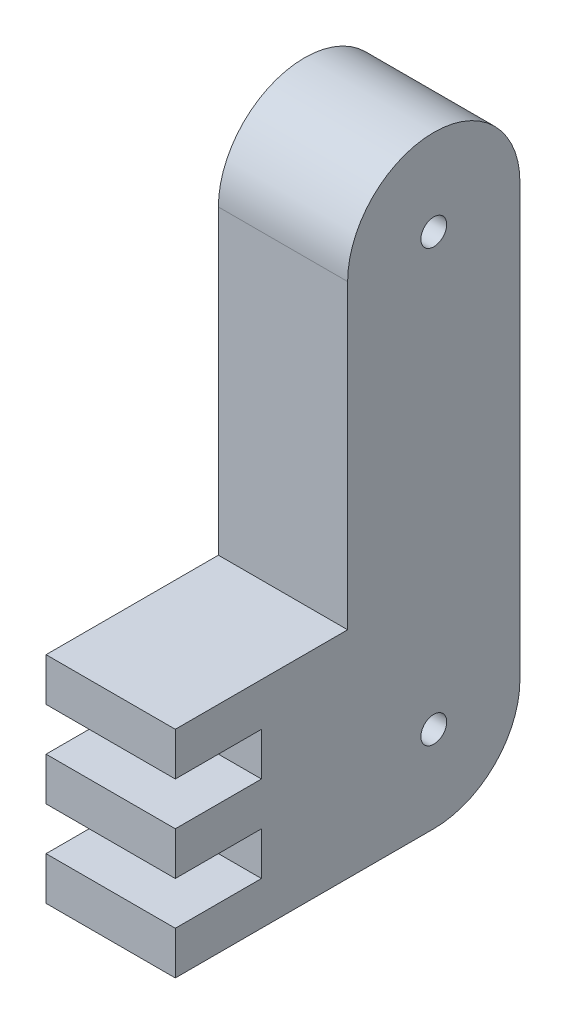
ISO-10303-21;
HEADER;
FILE_DESCRIPTION(('STEP AP214'),'2;1');
FILE_NAME('part.step','',(''),(''),'','','');
FILE_SCHEMA(('AUTOMOTIVE_DESIGN { 1 0 10303 214 1 1 1 1 }'));
ENDSEC;
DATA;
#1=APPLICATION_CONTEXT('core data for automotive mechanical design processes');
#2=APPLICATION_PROTOCOL_DEFINITION('international standard','automotive_design',2000,#1);
#3=PRODUCT_CONTEXT('',#1,'mechanical');
#4=PRODUCT('Part','Part','',(#3));
#5=PRODUCT_RELATED_PRODUCT_CATEGORY('part','',(#4));
#6=PRODUCT_DEFINITION_FORMATION('','',#4);
#7=PRODUCT_DEFINITION_CONTEXT('part definition',#1,'design');
#8=PRODUCT_DEFINITION('design','',#6,#7);
#9=PRODUCT_DEFINITION_SHAPE('','',#8);
#10=(LENGTH_UNIT() NAMED_UNIT(*) SI_UNIT(.MILLI.,.METRE.));
#11=(NAMED_UNIT(*) PLANE_ANGLE_UNIT() SI_UNIT($,.RADIAN.));
#12=(NAMED_UNIT(*) SI_UNIT($,.STERADIAN.) SOLID_ANGLE_UNIT());
#13=UNCERTAINTY_MEASURE_WITH_UNIT(LENGTH_MEASURE(1.E-05),#10,'distance_accuracy_value','');
#14=(GEOMETRIC_REPRESENTATION_CONTEXT(3) GLOBAL_UNCERTAINTY_ASSIGNED_CONTEXT((#13)) GLOBAL_UNIT_ASSIGNED_CONTEXT((#10,
#11,#12)) REPRESENTATION_CONTEXT('',''));
#15=CARTESIAN_POINT('',(0.,0.,0.));
#16=DIRECTION('',(0.,0.,1.));
#17=DIRECTION('',(1.,0.,0.));
#18=AXIS2_PLACEMENT_3D('',#15,#16,#17);
#19=CARTESIAN_POINT('',(15.,15.,30.));
#20=DIRECTION('',(0.,0.,-1.));
#21=DIRECTION('',(0.,1.,0.));
#22=AXIS2_PLACEMENT_3D('',#19,#20,#21);
#23=PLANE('',#22);
#24=DIRECTION('',(0.,-1.,0.));
#25=VECTOR('',#24,1.);
#26=CARTESIAN_POINT('',(0.,15.,30.));
#27=LINE('',#26,#25);
#28=CARTESIAN_POINT('',(0.,15.,30.));
#29=VERTEX_POINT('',#28);
#30=CARTESIAN_POINT('',(0.,10.,30.));
#31=VERTEX_POINT('',#30);
#32=EDGE_CURVE('E268',#29,#31,#27,.T.);
#33=ORIENTED_EDGE('',*,*,#32,.T.);
#34=DIRECTION('',(1.,0.,0.));
#35=VECTOR('',#34,1.);
#36=CARTESIAN_POINT('',(0.,10.,30.));
#37=LINE('',#36,#35);
#38=CARTESIAN_POINT('',(15.,10.,30.));
#39=VERTEX_POINT('',#38);
#40=EDGE_CURVE('E186',#31,#39,#37,.T.);
#41=ORIENTED_EDGE('',*,*,#40,.T.);
#42=DIRECTION('',(0.,-1.,0.));
#43=VECTOR('',#42,1.);
#44=CARTESIAN_POINT('',(15.,15.,30.));
#45=LINE('',#44,#43);
#46=CARTESIAN_POINT('',(15.,15.,30.));
#47=VERTEX_POINT('',#46);
#48=EDGE_CURVE('E243',#47,#39,#45,.T.);
#49=ORIENTED_EDGE('',*,*,#48,.F.);
#50=DIRECTION('',(-1.,0.,0.));
#51=VECTOR('',#50,1.);
#52=CARTESIAN_POINT('',(15.,15.,30.));
#53=LINE('',#52,#51);
#54=EDGE_CURVE('E267',#47,#29,#53,.T.);
#55=ORIENTED_EDGE('',*,*,#54,.T.);
#56=EDGE_LOOP('',(#33,#41,#49,#55));
#57=FACE_BOUND('',#56,.T.);
#58=ADVANCED_FACE('F39',(#57),#23,.F.);
#59=CARTESIAN_POINT('',(15.,5.,30.));
#60=VERTEX_POINT('',#59);
#61=CARTESIAN_POINT('',(15.,0.,30.));
#62=VERTEX_POINT('',#61);
#63=EDGE_CURVE('E248',#60,#62,#45,.T.);
#64=ORIENTED_EDGE('',*,*,#63,.F.);
#65=DIRECTION('',(1.,0.,0.));
#66=VECTOR('',#65,1.);
#67=CARTESIAN_POINT('',(0.,5.,30.));
#68=LINE('',#67,#66);
#69=CARTESIAN_POINT('',(0.,5.,30.));
#70=VERTEX_POINT('',#69);
#71=EDGE_CURVE('E155',#70,#60,#68,.T.);
#72=ORIENTED_EDGE('',*,*,#71,.F.);
#73=CARTESIAN_POINT('',(0.,0.,30.));
#74=VERTEX_POINT('',#73);
#75=EDGE_CURVE('E171',#70,#74,#27,.T.);
#76=ORIENTED_EDGE('',*,*,#75,.T.);
#77=DIRECTION('',(1.,0.,0.));
#78=VECTOR('',#77,1.);
#79=CARTESIAN_POINT('',(0.,0.,30.));
#80=LINE('',#79,#78);
#81=EDGE_CURVE('E183',#74,#62,#80,.T.);
#82=ORIENTED_EDGE('',*,*,#81,.T.);
#83=EDGE_LOOP('',(#64,#72,#76,#82));
#84=FACE_BOUND('',#83,.T.);
#85=ADVANCED_FACE('F346',(#84),#23,.F.);
#86=CARTESIAN_POINT('',(15.,0.,0.));
#87=DIRECTION('',(1.,0.,0.));
#88=DIRECTION('',(0.,0.,-1.));
#89=AXIS2_PLACEMENT_3D('',#86,#87,#88);
#90=PLANE('',#89);
#91=DIRECTION('',(0.,0.,1.));
#92=VECTOR('',#91,1.);
#93=CARTESIAN_POINT('',(15.,10.,30.));
#94=LINE('',#93,#92);
#95=CARTESIAN_POINT('',(15.,10.,20.));
#96=VERTEX_POINT('',#95);
#97=EDGE_CURVE('E173',#96,#39,#94,.T.);
#98=ORIENTED_EDGE('',*,*,#97,.F.);
#99=DIRECTION('',(0.,1.,0.));
#100=VECTOR('',#99,1.);
#101=CARTESIAN_POINT('',(15.,10.,20.));
#102=LINE('',#101,#100);
#103=CARTESIAN_POINT('',(15.,5.,20.));
#104=VERTEX_POINT('',#103);
#105=EDGE_CURVE('E176',#104,#96,#102,.T.);
#106=ORIENTED_EDGE('',*,*,#105,.F.);
#107=DIRECTION('',(0.,0.,-1.));
#108=VECTOR('',#107,1.);
#109=CARTESIAN_POINT('',(15.,5.,30.));
#110=LINE('',#109,#108);
#111=EDGE_CURVE('E149',#60,#104,#110,.T.);
#112=ORIENTED_EDGE('',*,*,#111,.F.);
#113=ORIENTED_EDGE('',*,*,#63,.T.);
#114=DIRECTION('',(0.,0.,1.));
#115=VECTOR('',#114,1.);
#116=CARTESIAN_POINT('',(15.,0.,30.));
#117=LINE('',#116,#115);
#118=CARTESIAN_POINT('',(15.,0.,20.));
#119=VERTEX_POINT('',#118);
#120=EDGE_CURVE('E198',#119,#62,#117,.T.);
#121=ORIENTED_EDGE('',*,*,#120,.F.);
#122=DIRECTION('',(0.,1.,0.));
#123=VECTOR('',#122,1.);
#124=CARTESIAN_POINT('',(15.,0.,20.));
#125=LINE('',#124,#123);
#126=CARTESIAN_POINT('',(15.,-5.,20.));
#127=VERTEX_POINT('',#126);
#128=EDGE_CURVE('E210',#127,#119,#125,.T.);
#129=ORIENTED_EDGE('',*,*,#128,.F.);
#130=DIRECTION('',(0.,0.,-1.));
#131=VECTOR('',#130,1.);
#132=CARTESIAN_POINT('',(15.,-5.,30.));
#133=LINE('',#132,#131);
#134=CARTESIAN_POINT('',(15.,-5.,30.));
#135=VERTEX_POINT('',#134);
#136=EDGE_CURVE('E206',#135,#127,#133,.T.);
#137=ORIENTED_EDGE('',*,*,#136,.F.);
#138=CARTESIAN_POINT('',(15.,-10.,30.));
#139=VERTEX_POINT('',#138);
#140=EDGE_CURVE('E249',#135,#139,#45,.T.);
#141=ORIENTED_EDGE('',*,*,#140,.T.);
#142=DIRECTION('',(0.,0.,-1.));
#143=VECTOR('',#142,1.);
#144=CARTESIAN_POINT('',(15.,-10.,0.));
#145=LINE('',#144,#143);
#146=CARTESIAN_POINT('',(15.,-10.,0.));
#147=VERTEX_POINT('',#146);
#148=EDGE_CURVE('E247',#139,#147,#145,.T.);
#149=ORIENTED_EDGE('',*,*,#148,.T.);
#150=CARTESIAN_POINT('',(15.,0.,0.));
#151=DIRECTION('',(1.,0.,0.));
#152=DIRECTION('',(0.,0.,-1.));
#153=AXIS2_PLACEMENT_3D('',#150,#151,#152);
#154=CIRCLE('',#153,10.);
#155=CARTESIAN_POINT('',(15.,0.,-10.));
#156=VERTEX_POINT('',#155);
#157=EDGE_CURVE('E252',#147,#156,#154,.T.);
#158=ORIENTED_EDGE('',*,*,#157,.T.);
#159=DIRECTION('',(0.,1.,0.));
#160=VECTOR('',#159,1.);
#161=CARTESIAN_POINT('',(15.,50.,-10.));
#162=LINE('',#161,#160);
#163=CARTESIAN_POINT('',(15.,50.,-10.));
#164=VERTEX_POINT('',#163);
#165=EDGE_CURVE('E255',#156,#164,#162,.T.);
#166=ORIENTED_EDGE('',*,*,#165,.T.);
#167=CARTESIAN_POINT('',(15.,50.,0.));
#168=DIRECTION('',(1.,0.,0.));
#169=DIRECTION('',(0.,0.,-1.));
#170=AXIS2_PLACEMENT_3D('',#167,#168,#169);
#171=CIRCLE('',#170,10.);
#172=CARTESIAN_POINT('',(15.,50.,10.));
#173=VERTEX_POINT('',#172);
#174=EDGE_CURVE('E258',#164,#173,#171,.T.);
#175=ORIENTED_EDGE('',*,*,#174,.T.);
#176=DIRECTION('',(0.,-1.,0.));
#177=VECTOR('',#176,1.);
#178=CARTESIAN_POINT('',(15.,50.,10.));
#179=LINE('',#178,#177);
#180=CARTESIAN_POINT('',(15.,15.,10.));
#181=VERTEX_POINT('',#180);
#182=EDGE_CURVE('E261',#173,#181,#179,.T.);
#183=ORIENTED_EDGE('',*,*,#182,.T.);
#184=DIRECTION('',(0.,0.,1.));
#185=VECTOR('',#184,1.);
#186=CARTESIAN_POINT('',(15.,15.,10.));
#187=LINE('',#186,#185);
#188=EDGE_CURVE('E264',#181,#47,#187,.T.);
#189=ORIENTED_EDGE('',*,*,#188,.T.);
#190=ORIENTED_EDGE('',*,*,#48,.T.);
#191=EDGE_LOOP('',(#98,#106,#112,#113,#121,#129,#137,#141,#149,#158,#166,#175,#183,#189,#190));
#192=FACE_BOUND('',#191,.T.);
#193=CARTESIAN_POINT('',(15.,50.,0.));
#194=DIRECTION('',(1.,0.,0.));
#195=DIRECTION('',(0.,0.,-1.));
#196=AXIS2_PLACEMENT_3D('',#193,#194,#195);
#197=CIRCLE('',#196,1.5);
#198=CARTESIAN_POINT('',(15.,50.,-1.5));
#199=VERTEX_POINT('',#198);
#200=EDGE_CURVE('E235',#199,#199,#197,.T.);
#201=ORIENTED_EDGE('',*,*,#200,.F.);
#202=EDGE_LOOP('',(#201));
#203=FACE_BOUND('',#202,.T.);
#204=CARTESIAN_POINT('',(15.,0.,0.));
#205=DIRECTION('',(1.,0.,0.));
#206=DIRECTION('',(0.,0.,-1.));
#207=AXIS2_PLACEMENT_3D('',#204,#205,#206);
#208=CIRCLE('',#207,1.5);
#209=CARTESIAN_POINT('',(15.,0.,-1.5));
#210=VERTEX_POINT('',#209);
#211=EDGE_CURVE('E227',#210,#210,#208,.T.);
#212=ORIENTED_EDGE('',*,*,#211,.F.);
#213=EDGE_LOOP('',(#212));
#214=FACE_BOUND('',#213,.T.);
#215=ADVANCED_FACE('F334',(#192,#203,#214),#90,.T.);
#216=CARTESIAN_POINT('',(0.,0.,0.));
#217=DIRECTION('',(1.,0.,0.));
#218=DIRECTION('',(0.,0.,-1.));
#219=AXIS2_PLACEMENT_3D('',#216,#217,#218);
#220=PLANE('',#219);
#221=DIRECTION('',(0.,1.,0.));
#222=VECTOR('',#221,1.);
#223=CARTESIAN_POINT('',(0.,10.,20.));
#224=LINE('',#223,#222);
#225=CARTESIAN_POINT('',(0.,5.,20.));
#226=VERTEX_POINT('',#225);
#227=CARTESIAN_POINT('',(0.,10.,20.));
#228=VERTEX_POINT('',#227);
#229=EDGE_CURVE('E158',#226,#228,#224,.T.);
#230=ORIENTED_EDGE('',*,*,#229,.T.);
#231=DIRECTION('',(0.,0.,1.));
#232=VECTOR('',#231,1.);
#233=CARTESIAN_POINT('',(0.,10.,30.));
#234=LINE('',#233,#232);
#235=EDGE_CURVE('E164',#228,#31,#234,.T.);
#236=ORIENTED_EDGE('',*,*,#235,.T.);
#237=ORIENTED_EDGE('',*,*,#32,.F.);
#238=DIRECTION('',(0.,0.,1.));
#239=VECTOR('',#238,1.);
#240=CARTESIAN_POINT('',(0.,15.,10.));
#241=LINE('',#240,#239);
#242=CARTESIAN_POINT('',(0.,15.,10.));
#243=VERTEX_POINT('',#242);
#244=EDGE_CURVE('E287',#243,#29,#241,.T.);
#245=ORIENTED_EDGE('',*,*,#244,.F.);
#246=DIRECTION('',(0.,-1.,0.));
#247=VECTOR('',#246,1.);
#248=CARTESIAN_POINT('',(0.,50.,10.));
#249=LINE('',#248,#247);
#250=CARTESIAN_POINT('',(0.,50.,10.));
#251=VERTEX_POINT('',#250);
#252=EDGE_CURVE('E284',#251,#243,#249,.T.);
#253=ORIENTED_EDGE('',*,*,#252,.F.);
#254=CARTESIAN_POINT('',(0.,50.,0.));
#255=DIRECTION('',(1.,0.,0.));
#256=DIRECTION('',(0.,0.,-1.));
#257=AXIS2_PLACEMENT_3D('',#254,#255,#256);
#258=CIRCLE('',#257,10.);
#259=CARTESIAN_POINT('',(0.,50.,-10.));
#260=VERTEX_POINT('',#259);
#261=EDGE_CURVE('E281',#260,#251,#258,.T.);
#262=ORIENTED_EDGE('',*,*,#261,.F.);
#263=DIRECTION('',(0.,1.,0.));
#264=VECTOR('',#263,1.);
#265=CARTESIAN_POINT('',(0.,50.,-10.));
#266=LINE('',#265,#264);
#267=CARTESIAN_POINT('',(0.,0.,-10.));
#268=VERTEX_POINT('',#267);
#269=EDGE_CURVE('E278',#268,#260,#266,.T.);
#270=ORIENTED_EDGE('',*,*,#269,.F.);
#271=CARTESIAN_POINT('',(0.,0.,0.));
#272=DIRECTION('',(1.,0.,0.));
#273=DIRECTION('',(0.,0.,-1.));
#274=AXIS2_PLACEMENT_3D('',#271,#272,#273);
#275=CIRCLE('',#274,10.);
#276=CARTESIAN_POINT('',(0.,-10.,0.));
#277=VERTEX_POINT('',#276);
#278=EDGE_CURVE('E275',#277,#268,#275,.T.);
#279=ORIENTED_EDGE('',*,*,#278,.F.);
#280=DIRECTION('',(0.,0.,-1.));
#281=VECTOR('',#280,1.);
#282=CARTESIAN_POINT('',(0.,-10.,0.));
#283=LINE('',#282,#281);
#284=CARTESIAN_POINT('',(0.,-10.,30.));
#285=VERTEX_POINT('',#284);
#286=EDGE_CURVE('E272',#285,#277,#283,.T.);
#287=ORIENTED_EDGE('',*,*,#286,.F.);
#288=CARTESIAN_POINT('',(0.,-5.,30.));
#289=VERTEX_POINT('',#288);
#290=EDGE_CURVE('E239',#289,#285,#27,.T.);
#291=ORIENTED_EDGE('',*,*,#290,.F.);
#292=DIRECTION('',(0.,0.,-1.));
#293=VECTOR('',#292,1.);
#294=CARTESIAN_POINT('',(0.,-5.,30.));
#295=LINE('',#294,#293);
#296=CARTESIAN_POINT('',(0.,-5.,20.));
#297=VERTEX_POINT('',#296);
#298=EDGE_CURVE('E55',#289,#297,#295,.T.);
#299=ORIENTED_EDGE('',*,*,#298,.T.);
#300=DIRECTION('',(0.,1.,0.));
#301=VECTOR('',#300,1.);
#302=CARTESIAN_POINT('',(0.,0.,20.));
#303=LINE('',#302,#301);
#304=CARTESIAN_POINT('',(0.,0.,20.));
#305=VERTEX_POINT('',#304);
#306=EDGE_CURVE('E197',#297,#305,#303,.T.);
#307=ORIENTED_EDGE('',*,*,#306,.T.);
#308=DIRECTION('',(0.,0.,1.));
#309=VECTOR('',#308,1.);
#310=CARTESIAN_POINT('',(0.,0.,30.));
#311=LINE('',#310,#309);
#312=EDGE_CURVE('E202',#305,#74,#311,.T.);
#313=ORIENTED_EDGE('',*,*,#312,.T.);
#314=ORIENTED_EDGE('',*,*,#75,.F.);
#315=DIRECTION('',(0.,0.,-1.));
#316=VECTOR('',#315,1.);
#317=CARTESIAN_POINT('',(0.,5.,30.));
#318=LINE('',#317,#316);
#319=EDGE_CURVE('E63',#70,#226,#318,.T.);
#320=ORIENTED_EDGE('',*,*,#319,.T.);
#321=EDGE_LOOP('',(#230,#236,#237,#245,#253,#262,#270,#279,#287,#291,#299,#307,#313,#314,#320));
#322=FACE_BOUND('',#321,.T.);
#323=CARTESIAN_POINT('',(0.,50.,0.));
#324=DIRECTION('',(1.,0.,0.));
#325=DIRECTION('',(0.,0.,-1.));
#326=AXIS2_PLACEMENT_3D('',#323,#324,#325);
#327=CIRCLE('',#326,1.5);
#328=CARTESIAN_POINT('',(0.,50.,-1.5));
#329=VERTEX_POINT('',#328);
#330=EDGE_CURVE('E231',#329,#329,#327,.T.);
#331=ORIENTED_EDGE('',*,*,#330,.T.);
#332=EDGE_LOOP('',(#331));
#333=FACE_BOUND('',#332,.T.);
#334=CARTESIAN_POINT('',(0.,0.,0.));
#335=DIRECTION('',(1.,0.,0.));
#336=DIRECTION('',(0.,0.,-1.));
#337=AXIS2_PLACEMENT_3D('',#334,#335,#336);
#338=CIRCLE('',#337,1.5);
#339=CARTESIAN_POINT('',(0.,0.,-1.5));
#340=VERTEX_POINT('',#339);
#341=EDGE_CURVE('E190',#340,#340,#338,.T.);
#342=ORIENTED_EDGE('',*,*,#341,.T.);
#343=EDGE_LOOP('',(#342));
#344=FACE_BOUND('',#343,.T.);
#345=ADVANCED_FACE('F167',(#322,#333,#344),#220,.F.);
#346=ORIENTED_EDGE('',*,*,#140,.F.);
#347=DIRECTION('',(1.,0.,0.));
#348=VECTOR('',#347,1.);
#349=CARTESIAN_POINT('',(0.,-5.,30.));
#350=LINE('',#349,#348);
#351=EDGE_CURVE('E205',#289,#135,#350,.T.);
#352=ORIENTED_EDGE('',*,*,#351,.F.);
#353=ORIENTED_EDGE('',*,*,#290,.T.);
#354=DIRECTION('',(-1.,0.,0.));
#355=VECTOR('',#354,1.);
#356=CARTESIAN_POINT('',(15.,-10.,30.));
#357=LINE('',#356,#355);
#358=EDGE_CURVE('E11',#139,#285,#357,.T.);
#359=ORIENTED_EDGE('',*,*,#358,.F.);
#360=EDGE_LOOP('',(#346,#352,#353,#359));
#361=FACE_BOUND('',#360,.T.);
#362=ADVANCED_FACE('F41',(#361),#23,.F.);
#363=CARTESIAN_POINT('',(15.,-10.,0.));
#364=DIRECTION('',(0.,1.,0.));
#365=DIRECTION('',(0.,0.,1.));
#366=AXIS2_PLACEMENT_3D('',#363,#364,#365);
#367=PLANE('',#366);
#368=ORIENTED_EDGE('',*,*,#286,.T.);
#369=DIRECTION('',(-1.,0.,0.));
#370=VECTOR('',#369,1.);
#371=CARTESIAN_POINT('',(15.,-10.,0.));
#372=LINE('',#371,#370);
#373=EDGE_CURVE('E48',#147,#277,#372,.T.);
#374=ORIENTED_EDGE('',*,*,#373,.F.);
#375=ORIENTED_EDGE('',*,*,#148,.F.);
#376=ORIENTED_EDGE('',*,*,#358,.T.);
#377=EDGE_LOOP('',(#368,#374,#375,#376));
#378=FACE_BOUND('',#377,.T.);
#379=ADVANCED_FACE('F340',(#378),#367,.F.);
#380=CARTESIAN_POINT('',(15.,0.,0.));
#381=DIRECTION('',(-1.,0.,0.));
#382=DIRECTION('',(0.,0.,1.));
#383=AXIS2_PLACEMENT_3D('',#380,#381,#382);
#384=CYLINDRICAL_SURFACE('',#383,10.);
#385=ORIENTED_EDGE('',*,*,#278,.T.);
#386=DIRECTION('',(-1.,0.,0.));
#387=VECTOR('',#386,1.);
#388=CARTESIAN_POINT('',(15.,0.,-10.));
#389=LINE('',#388,#387);
#390=EDGE_CURVE('E305',#156,#268,#389,.T.);
#391=ORIENTED_EDGE('',*,*,#390,.F.);
#392=ORIENTED_EDGE('',*,*,#157,.F.);
#393=ORIENTED_EDGE('',*,*,#373,.T.);
#394=EDGE_LOOP('',(#385,#391,#392,#393));
#395=FACE_BOUND('',#394,.T.);
#396=ADVANCED_FACE('F314',(#395),#384,.T.);
#397=CARTESIAN_POINT('',(15.,50.,-10.));
#398=DIRECTION('',(0.,0.,1.));
#399=DIRECTION('',(1.,0.,0.));
#400=AXIS2_PLACEMENT_3D('',#397,#398,#399);
#401=PLANE('',#400);
#402=ORIENTED_EDGE('',*,*,#269,.T.);
#403=DIRECTION('',(-1.,0.,0.));
#404=VECTOR('',#403,1.);
#405=CARTESIAN_POINT('',(15.,50.,-10.));
#406=LINE('',#405,#404);
#407=EDGE_CURVE('E301',#164,#260,#406,.T.);
#408=ORIENTED_EDGE('',*,*,#407,.F.);
#409=ORIENTED_EDGE('',*,*,#165,.F.);
#410=ORIENTED_EDGE('',*,*,#390,.T.);
#411=EDGE_LOOP('',(#402,#408,#409,#410));
#412=FACE_BOUND('',#411,.T.);
#413=ADVANCED_FACE('F325',(#412),#401,.F.);
#414=CARTESIAN_POINT('',(15.,50.,0.));
#415=DIRECTION('',(-1.,0.,0.));
#416=DIRECTION('',(0.,0.,1.));
#417=AXIS2_PLACEMENT_3D('',#414,#415,#416);
#418=CYLINDRICAL_SURFACE('',#417,10.);
#419=ORIENTED_EDGE('',*,*,#261,.T.);
#420=DIRECTION('',(-1.,0.,0.));
#421=VECTOR('',#420,1.);
#422=CARTESIAN_POINT('',(15.,50.,10.));
#423=LINE('',#422,#421);
#424=EDGE_CURVE('E297',#173,#251,#423,.T.);
#425=ORIENTED_EDGE('',*,*,#424,.F.);
#426=ORIENTED_EDGE('',*,*,#174,.F.);
#427=ORIENTED_EDGE('',*,*,#407,.T.);
#428=EDGE_LOOP('',(#419,#425,#426,#427));
#429=FACE_BOUND('',#428,.T.);
#430=ADVANCED_FACE('F329',(#429),#418,.T.);
#431=CARTESIAN_POINT('',(15.,50.,10.));
#432=DIRECTION('',(0.,0.,-1.));
#433=DIRECTION('',(0.,1.,0.));
#434=AXIS2_PLACEMENT_3D('',#431,#432,#433);
#435=PLANE('',#434);
#436=ORIENTED_EDGE('',*,*,#252,.T.);
#437=DIRECTION('',(-1.,0.,0.));
#438=VECTOR('',#437,1.);
#439=CARTESIAN_POINT('',(15.,15.,10.));
#440=LINE('',#439,#438);
#441=EDGE_CURVE('E293',#181,#243,#440,.T.);
#442=ORIENTED_EDGE('',*,*,#441,.F.);
#443=ORIENTED_EDGE('',*,*,#182,.F.);
#444=ORIENTED_EDGE('',*,*,#424,.T.);
#445=EDGE_LOOP('',(#436,#442,#443,#444));
#446=FACE_BOUND('',#445,.T.);
#447=ADVANCED_FACE('F360',(#446),#435,.F.);
#448=CARTESIAN_POINT('',(15.,15.,10.));
#449=DIRECTION('',(0.,-1.,0.));
#450=DIRECTION('',(0.,0.,-1.));
#451=AXIS2_PLACEMENT_3D('',#448,#449,#450);
#452=PLANE('',#451);
#453=ORIENTED_EDGE('',*,*,#244,.T.);
#454=ORIENTED_EDGE('',*,*,#54,.F.);
#455=ORIENTED_EDGE('',*,*,#188,.F.);
#456=ORIENTED_EDGE('',*,*,#441,.T.);
#457=EDGE_LOOP('',(#453,#454,#455,#456));
#458=FACE_BOUND('',#457,.T.);
#459=ADVANCED_FACE('F357',(#458),#452,.F.);
#460=CARTESIAN_POINT('',(15.,50.,0.));
#461=DIRECTION('',(-1.,0.,0.));
#462=DIRECTION('',(0.,0.,1.));
#463=AXIS2_PLACEMENT_3D('',#460,#461,#462);
#464=CYLINDRICAL_SURFACE('',#463,1.5);
#465=ORIENTED_EDGE('',*,*,#200,.T.);
#466=EDGE_LOOP('',(#465));
#467=FACE_BOUND('',#466,.T.);
#468=ORIENTED_EDGE('',*,*,#330,.F.);
#469=EDGE_LOOP('',(#468));
#470=FACE_BOUND('',#469,.T.);
#471=ADVANCED_FACE('F367',(#467,#470),#464,.F.);
#472=CARTESIAN_POINT('',(15.,0.,0.));
#473=DIRECTION('',(-1.,0.,0.));
#474=DIRECTION('',(0.,0.,1.));
#475=AXIS2_PLACEMENT_3D('',#472,#473,#474);
#476=CYLINDRICAL_SURFACE('',#475,1.5);
#477=ORIENTED_EDGE('',*,*,#211,.T.);
#478=EDGE_LOOP('',(#477));
#479=FACE_BOUND('',#478,.T.);
#480=ORIENTED_EDGE('',*,*,#341,.F.);
#481=EDGE_LOOP('',(#480));
#482=FACE_BOUND('',#481,.T.);
#483=ADVANCED_FACE('F387',(#479,#482),#476,.F.);
#484=CARTESIAN_POINT('',(0.,0.,30.));
#485=DIRECTION('',(0.,1.,0.));
#486=DIRECTION('',(0.,0.,1.));
#487=AXIS2_PLACEMENT_3D('',#484,#485,#486);
#488=PLANE('',#487);
#489=ORIENTED_EDGE('',*,*,#120,.T.);
#490=ORIENTED_EDGE('',*,*,#81,.F.);
#491=ORIENTED_EDGE('',*,*,#312,.F.);
#492=DIRECTION('',(1.,0.,0.));
#493=VECTOR('',#492,1.);
#494=CARTESIAN_POINT('',(0.,0.,20.));
#495=LINE('',#494,#493);
#496=EDGE_CURVE('E219',#305,#119,#495,.T.);
#497=ORIENTED_EDGE('',*,*,#496,.T.);
#498=EDGE_LOOP('',(#489,#490,#491,#497));
#499=FACE_BOUND('',#498,.T.);
#500=ADVANCED_FACE('F391',(#499),#488,.F.);
#501=CARTESIAN_POINT('',(0.,0.,20.));
#502=DIRECTION('',(0.,0.,-1.));
#503=DIRECTION('',(-1.,0.,0.));
#504=AXIS2_PLACEMENT_3D('',#501,#502,#503);
#505=PLANE('',#504);
#506=ORIENTED_EDGE('',*,*,#128,.T.);
#507=ORIENTED_EDGE('',*,*,#496,.F.);
#508=ORIENTED_EDGE('',*,*,#306,.F.);
#509=DIRECTION('',(1.,0.,0.));
#510=VECTOR('',#509,1.);
#511=CARTESIAN_POINT('',(0.,-5.,20.));
#512=LINE('',#511,#510);
#513=EDGE_CURVE('E222',#297,#127,#512,.T.);
#514=ORIENTED_EDGE('',*,*,#513,.T.);
#515=EDGE_LOOP('',(#506,#507,#508,#514));
#516=FACE_BOUND('',#515,.T.);
#517=ADVANCED_FACE('F396',(#516),#505,.F.);
#518=CARTESIAN_POINT('',(0.,-5.,30.));
#519=DIRECTION('',(0.,-1.,0.));
#520=DIRECTION('',(0.,0.,-1.));
#521=AXIS2_PLACEMENT_3D('',#518,#519,#520);
#522=PLANE('',#521);
#523=ORIENTED_EDGE('',*,*,#136,.T.);
#524=ORIENTED_EDGE('',*,*,#513,.F.);
#525=ORIENTED_EDGE('',*,*,#298,.F.);
#526=ORIENTED_EDGE('',*,*,#351,.T.);
#527=EDGE_LOOP('',(#523,#524,#525,#526));
#528=FACE_BOUND('',#527,.T.);
#529=ADVANCED_FACE('F393',(#528),#522,.F.);
#530=CARTESIAN_POINT('',(0.,10.,30.));
#531=DIRECTION('',(0.,1.,0.));
#532=DIRECTION('',(0.,0.,1.));
#533=AXIS2_PLACEMENT_3D('',#530,#531,#532);
#534=PLANE('',#533);
#535=ORIENTED_EDGE('',*,*,#97,.T.);
#536=ORIENTED_EDGE('',*,*,#40,.F.);
#537=ORIENTED_EDGE('',*,*,#235,.F.);
#538=DIRECTION('',(1.,0.,0.));
#539=VECTOR('',#538,1.);
#540=CARTESIAN_POINT('',(0.,10.,20.));
#541=LINE('',#540,#539);
#542=EDGE_CURVE('E154',#228,#96,#541,.T.);
#543=ORIENTED_EDGE('',*,*,#542,.T.);
#544=EDGE_LOOP('',(#535,#536,#537,#543));
#545=FACE_BOUND('',#544,.T.);
#546=ADVANCED_FACE('F351',(#545),#534,.F.);
#547=CARTESIAN_POINT('',(0.,10.,20.));
#548=DIRECTION('',(0.,0.,-1.));
#549=DIRECTION('',(-1.,0.,0.));
#550=AXIS2_PLACEMENT_3D('',#547,#548,#549);
#551=PLANE('',#550);
#552=ORIENTED_EDGE('',*,*,#105,.T.);
#553=ORIENTED_EDGE('',*,*,#542,.F.);
#554=ORIENTED_EDGE('',*,*,#229,.F.);
#555=DIRECTION('',(1.,0.,0.));
#556=VECTOR('',#555,1.);
#557=CARTESIAN_POINT('',(0.,5.,20.));
#558=LINE('',#557,#556);
#559=EDGE_CURVE('E145',#226,#104,#558,.T.);
#560=ORIENTED_EDGE('',*,*,#559,.T.);
#561=EDGE_LOOP('',(#552,#553,#554,#560));
#562=FACE_BOUND('',#561,.T.);
#563=ADVANCED_FACE('F159',(#562),#551,.F.);
#564=CARTESIAN_POINT('',(0.,5.,30.));
#565=DIRECTION('',(0.,-1.,0.));
#566=DIRECTION('',(0.,0.,-1.));
#567=AXIS2_PLACEMENT_3D('',#564,#565,#566);
#568=PLANE('',#567);
#569=ORIENTED_EDGE('',*,*,#111,.T.);
#570=ORIENTED_EDGE('',*,*,#559,.F.);
#571=ORIENTED_EDGE('',*,*,#319,.F.);
#572=ORIENTED_EDGE('',*,*,#71,.T.);
#573=EDGE_LOOP('',(#569,#570,#571,#572));
#574=FACE_BOUND('',#573,.T.);
#575=ADVANCED_FACE('F147',(#574),#568,.F.);
#576=CLOSED_SHELL('',(#58,#85,#215,#345,#362,#379,#396,#413,#430,#447,#459,#471,#483,#500,#517,
#529,#546,#563,#575));
#577=MANIFOLD_SOLID_BREP('B2',#576);
#578=ADVANCED_BREP_SHAPE_REPRESENTATION('',(#18,#577),#14);
#579=SHAPE_DEFINITION_REPRESENTATION(#9,#578);
ENDSEC;
END-ISO-10303-21;
